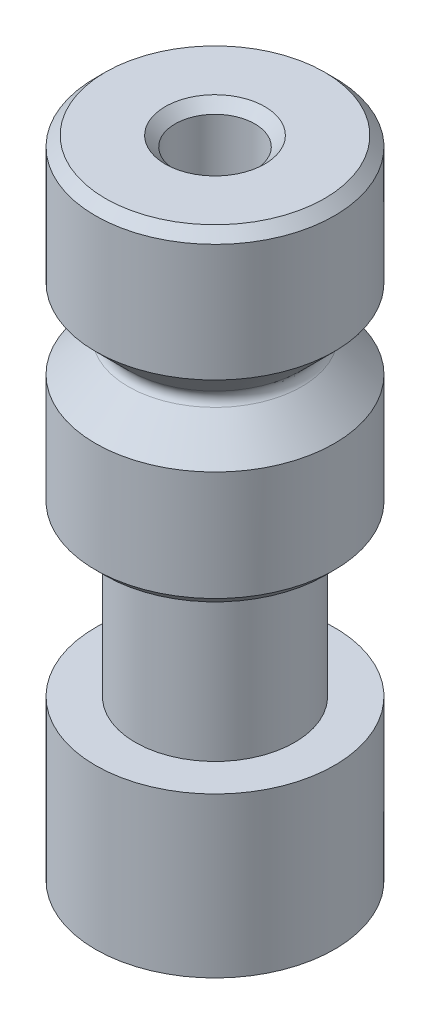
ISO-10303-21;
HEADER;
FILE_DESCRIPTION(('STEP AP214'),'2;1');
FILE_NAME('part.step','',(''),(''),'','','');
FILE_SCHEMA(('AUTOMOTIVE_DESIGN { 1 0 10303 214 1 1 1 1 }'));
ENDSEC;
DATA;
#1=APPLICATION_CONTEXT('core data for automotive mechanical design processes');
#2=APPLICATION_PROTOCOL_DEFINITION('international standard','automotive_design',2000,#1);
#3=PRODUCT_CONTEXT('',#1,'mechanical');
#4=PRODUCT('Part','Part','',(#3));
#5=PRODUCT_RELATED_PRODUCT_CATEGORY('part','',(#4));
#6=PRODUCT_DEFINITION_FORMATION('','',#4);
#7=PRODUCT_DEFINITION_CONTEXT('part definition',#1,'design');
#8=PRODUCT_DEFINITION('design','',#6,#7);
#9=PRODUCT_DEFINITION_SHAPE('','',#8);
#10=(LENGTH_UNIT() NAMED_UNIT(*) SI_UNIT(.MILLI.,.METRE.));
#11=(NAMED_UNIT(*) PLANE_ANGLE_UNIT() SI_UNIT($,.RADIAN.));
#12=(NAMED_UNIT(*) SI_UNIT($,.STERADIAN.) SOLID_ANGLE_UNIT());
#13=UNCERTAINTY_MEASURE_WITH_UNIT(LENGTH_MEASURE(1.E-05),#10,'distance_accuracy_value','');
#14=(GEOMETRIC_REPRESENTATION_CONTEXT(3) GLOBAL_UNCERTAINTY_ASSIGNED_CONTEXT((#13)) GLOBAL_UNIT_ASSIGNED_CONTEXT((#10,
#11,#12)) REPRESENTATION_CONTEXT('',''));
#15=CARTESIAN_POINT('',(0.,0.,0.));
#16=DIRECTION('',(0.,0.,1.));
#17=DIRECTION('',(1.,0.,0.));
#18=AXIS2_PLACEMENT_3D('',#15,#16,#17);
#19=CARTESIAN_POINT('',(0.,54.1999536612987,0.));
#20=DIRECTION('',(0.,1.,0.));
#21=DIRECTION('',(0.,0.,1.));
#22=AXIS2_PLACEMENT_3D('',#19,#20,#21);
#23=CYLINDRICAL_SURFACE('',#22,2.99999999999999);
#24=CARTESIAN_POINT('',(0.,-12.,0.));
#25=DIRECTION('',(0.,1.,0.));
#26=DIRECTION('',(0.,0.,1.));
#27=AXIS2_PLACEMENT_3D('',#24,#25,#26);
#28=CIRCLE('',#27,2.99999999999998);
#29=CARTESIAN_POINT('',(0.,-12.,2.99999999999998));
#30=VERTEX_POINT('',#29);
#31=EDGE_CURVE('E71',#30,#30,#28,.T.);
#32=ORIENTED_EDGE('',*,*,#31,.T.);
#33=EDGE_LOOP('',(#32));
#34=FACE_BOUND('',#33,.T.);
#35=CARTESIAN_POINT('',(0.,-8.,0.));
#36=DIRECTION('',(0.,1.,0.));
#37=DIRECTION('',(0.,0.,1.));
#38=AXIS2_PLACEMENT_3D('',#35,#36,#37);
#39=CIRCLE('',#38,2.99999999999999);
#40=CARTESIAN_POINT('',(0.,-8.,2.99999999999999));
#41=VERTEX_POINT('',#40);
#42=EDGE_CURVE('E92',#41,#41,#39,.T.);
#43=ORIENTED_EDGE('',*,*,#42,.F.);
#44=EDGE_LOOP('',(#43));
#45=FACE_BOUND('',#44,.T.);
#46=ADVANCED_FACE('F33',(#34,#45),#23,.T.);
#47=CARTESIAN_POINT('',(-2.99999999999998,-12.,0.));
#48=DIRECTION('',(0.,-1.,0.));
#49=DIRECTION('',(0.,0.,-1.));
#50=AXIS2_PLACEMENT_3D('',#47,#48,#49);
#51=PLANE('',#50);
#52=CARTESIAN_POINT('',(0.,-12.,0.));
#53=DIRECTION('',(0.,1.,0.));
#54=DIRECTION('',(0.,0.,1.));
#55=AXIS2_PLACEMENT_3D('',#52,#53,#54);
#56=CIRCLE('',#55,1.99999999999999);
#57=CARTESIAN_POINT('',(0.,-12.,1.99999999999999));
#58=VERTEX_POINT('',#57);
#59=EDGE_CURVE('E74',#58,#58,#56,.T.);
#60=ORIENTED_EDGE('',*,*,#59,.T.);
#61=EDGE_LOOP('',(#60));
#62=FACE_BOUND('',#61,.T.);
#63=ORIENTED_EDGE('',*,*,#31,.F.);
#64=EDGE_LOOP('',(#63));
#65=FACE_BOUND('',#64,.T.);
#66=ADVANCED_FACE('F100',(#62,#65),#51,.T.);
#67=CARTESIAN_POINT('',(0.,54.1999536612987,0.));
#68=DIRECTION('',(0.,1.,0.));
#69=DIRECTION('',(0.,0.,1.));
#70=AXIS2_PLACEMENT_3D('',#67,#68,#69);
#71=CYLINDRICAL_SURFACE('',#70,1.99999999999999);
#72=CARTESIAN_POINT('',(0.,-12.5,0.));
#73=DIRECTION('',(0.,-1.,0.));
#74=DIRECTION('',(0.,0.,-1.));
#75=AXIS2_PLACEMENT_3D('',#72,#73,#74);
#76=CIRCLE('',#75,1.99999999999999);
#77=CARTESIAN_POINT('',(0.,-12.5,-1.99999999999999));
#78=VERTEX_POINT('',#77);
#79=EDGE_CURVE('E62',#78,#78,#76,.F.);
#80=ORIENTED_EDGE('',*,*,#79,.T.);
#81=EDGE_LOOP('',(#80));
#82=FACE_BOUND('',#81,.T.);
#83=ORIENTED_EDGE('',*,*,#59,.F.);
#84=EDGE_LOOP('',(#83));
#85=FACE_BOUND('',#84,.T.);
#86=ADVANCED_FACE('F106',(#82,#85),#71,.T.);
#87=CARTESIAN_POINT('',(-1.99999999999999,-13.,0.));
#88=DIRECTION('',(0.,-1.,0.));
#89=DIRECTION('',(0.,0.,-1.));
#90=AXIS2_PLACEMENT_3D('',#87,#88,#89);
#91=PLANE('',#90);
#92=CARTESIAN_POINT('',(0.,-13.,0.));
#93=DIRECTION('',(0.,-1.,0.));
#94=DIRECTION('',(0.,0.,-1.));
#95=AXIS2_PLACEMENT_3D('',#92,#93,#94);
#96=CIRCLE('',#95,1.49999999999999);
#97=CARTESIAN_POINT('',(0.,-13.,-1.49999999999999));
#98=VERTEX_POINT('',#97);
#99=EDGE_CURVE('E59',#98,#98,#96,.T.);
#100=ORIENTED_EDGE('',*,*,#99,.T.);
#101=EDGE_LOOP('',(#100));
#102=FACE_BOUND('',#101,.T.);
#103=CARTESIAN_POINT('',(0.,-13.,0.));
#104=DIRECTION('',(0.,1.,0.));
#105=DIRECTION('',(0.,0.,1.));
#106=AXIS2_PLACEMENT_3D('',#103,#104,#105);
#107=CIRCLE('',#106,0.999999999999992);
#108=CARTESIAN_POINT('',(0.,-13.,0.999999999999992));
#109=VERTEX_POINT('',#108);
#110=EDGE_CURVE('E77',#109,#109,#107,.T.);
#111=ORIENTED_EDGE('',*,*,#110,.T.);
#112=EDGE_LOOP('',(#111));
#113=FACE_BOUND('',#112,.T.);
#114=ADVANCED_FACE('F145',(#102,#113),#91,.T.);
#115=CARTESIAN_POINT('',(0.,54.1999536612987,0.));
#116=DIRECTION('',(0.,1.,0.));
#117=DIRECTION('',(0.,0.,1.));
#118=AXIS2_PLACEMENT_3D('',#115,#116,#117);
#119=CYLINDRICAL_SURFACE('',#118,0.999999999999993);
#120=CARTESIAN_POINT('',(0.,3.95,0.));
#121=DIRECTION('',(0.,1.,0.));
#122=DIRECTION('',(0.,0.,1.));
#123=AXIS2_PLACEMENT_3D('',#120,#121,#122);
#124=CIRCLE('',#123,0.999999999999993);
#125=CARTESIAN_POINT('',(0.,3.95,0.999999999999993));
#126=VERTEX_POINT('',#125);
#127=EDGE_CURVE('E68',#126,#126,#124,.T.);
#128=ORIENTED_EDGE('',*,*,#127,.T.);
#129=EDGE_LOOP('',(#128));
#130=FACE_BOUND('',#129,.T.);
#131=ORIENTED_EDGE('',*,*,#110,.F.);
#132=EDGE_LOOP('',(#131));
#133=FACE_BOUND('',#132,.T.);
#134=ADVANCED_FACE('F137',(#130,#133),#119,.F.);
#135=CARTESIAN_POINT('',(-0.999999999999994,4.2,0.));
#136=DIRECTION('',(0.,1.,0.));
#137=DIRECTION('',(0.,0.,1.));
#138=AXIS2_PLACEMENT_3D('',#135,#136,#137);
#139=PLANE('',#138);
#140=CARTESIAN_POINT('',(0.,4.2,0.));
#141=DIRECTION('',(0.,1.,0.));
#142=DIRECTION('',(0.,0.,1.));
#143=AXIS2_PLACEMENT_3D('',#140,#141,#142);
#144=CIRCLE('',#143,2.74999999999998);
#145=CARTESIAN_POINT('',(0.,4.2,2.74999999999998));
#146=VERTEX_POINT('',#145);
#147=EDGE_CURVE('E48',#146,#146,#144,.T.);
#148=ORIENTED_EDGE('',*,*,#147,.T.);
#149=EDGE_LOOP('',(#148));
#150=FACE_BOUND('',#149,.T.);
#151=CARTESIAN_POINT('',(0.,4.2,0.));
#152=DIRECTION('',(0.,1.,0.));
#153=DIRECTION('',(0.,0.,1.));
#154=AXIS2_PLACEMENT_3D('',#151,#152,#153);
#155=CIRCLE('',#154,1.25);
#156=CARTESIAN_POINT('',(0.,4.2,1.25));
#157=VERTEX_POINT('',#156);
#158=EDGE_CURVE('E65',#157,#157,#155,.F.);
#159=ORIENTED_EDGE('',*,*,#158,.T.);
#160=EDGE_LOOP('',(#159));
#161=FACE_BOUND('',#160,.T.);
#162=ADVANCED_FACE('F133',(#150,#161),#139,.T.);
#163=CARTESIAN_POINT('',(0.,54.1999536612987,0.));
#164=DIRECTION('',(0.,1.,0.));
#165=DIRECTION('',(0.,0.,1.));
#166=AXIS2_PLACEMENT_3D('',#163,#164,#165);
#167=CYLINDRICAL_SURFACE('',#166,2.99999999999999);
#168=CARTESIAN_POINT('',(0.,3.95,0.));
#169=DIRECTION('',(0.,1.,0.));
#170=DIRECTION('',(0.,0.,1.));
#171=AXIS2_PLACEMENT_3D('',#168,#169,#170);
#172=CIRCLE('',#171,2.99999999999999);
#173=CARTESIAN_POINT('',(0.,3.95,2.99999999999999));
#174=VERTEX_POINT('',#173);
#175=EDGE_CURVE('E44',#174,#174,#172,.F.);
#176=ORIENTED_EDGE('',*,*,#175,.T.);
#177=EDGE_LOOP('',(#176));
#178=FACE_BOUND('',#177,.T.);
#179=CARTESIAN_POINT('',(0.,0.999999999999994,0.));
#180=DIRECTION('',(0.,1.,0.));
#181=DIRECTION('',(0.,0.,1.));
#182=AXIS2_PLACEMENT_3D('',#179,#180,#181);
#183=CIRCLE('',#182,2.99999999999999);
#184=CARTESIAN_POINT('',(0.,0.999999999999994,2.99999999999999));
#185=VERTEX_POINT('',#184);
#186=EDGE_CURVE('E80',#185,#185,#183,.T.);
#187=ORIENTED_EDGE('',*,*,#186,.T.);
#188=EDGE_LOOP('',(#187));
#189=FACE_BOUND('',#188,.T.);
#190=ADVANCED_FACE('F136',(#178,#189),#167,.T.);
#191=CARTESIAN_POINT('',(0.,0.999999999999994,0.));
#192=DIRECTION('',(0.,1.,0.));
#193=DIRECTION('',(0.,0.,1.));
#194=AXIS2_PLACEMENT_3D('',#191,#192,#193);
#195=CONICAL_SURFACE('',#194,2.99999999999999,0.785398163397448);
#196=CARTESIAN_POINT('',(0.,0.176776695296637,0.));
#197=DIRECTION('',(0.,1.,0.));
#198=DIRECTION('',(0.,0.,1.));
#199=AXIS2_PLACEMENT_3D('',#196,#197,#198);
#200=CIRCLE('',#199,2.17677669529663);
#201=CARTESIAN_POINT('',(0.,0.176776695296637,2.17677669529663));
#202=VERTEX_POINT('',#201);
#203=EDGE_CURVE('E40',#202,#202,#200,.T.);
#204=ORIENTED_EDGE('',*,*,#203,.T.);
#205=EDGE_LOOP('',(#204));
#206=FACE_BOUND('',#205,.T.);
#207=ORIENTED_EDGE('',*,*,#186,.F.);
#208=EDGE_LOOP('',(#207));
#209=FACE_BOUND('',#208,.T.);
#210=ADVANCED_FACE('F159',(#206,#209),#195,.T.);
#211=CARTESIAN_POINT('',(0.,0.,0.));
#212=DIRECTION('',(0.,-1.,0.));
#213=DIRECTION('',(0.,0.,-1.));
#214=AXIS2_PLACEMENT_3D('',#211,#212,#213);
#215=CONICAL_SURFACE('',#214,1.99999999999999,0.785398163397448);
#216=CARTESIAN_POINT('',(0.,-0.176776695296637,0.));
#217=DIRECTION('',(0.,-1.,0.));
#218=DIRECTION('',(0.,0.,-1.));
#219=AXIS2_PLACEMENT_3D('',#216,#217,#218);
#220=CIRCLE('',#219,2.17677669529663);
#221=CARTESIAN_POINT('',(0.,-0.176776695296637,-2.17677669529663));
#222=VERTEX_POINT('',#221);
#223=EDGE_CURVE('E10',#222,#222,#220,.T.);
#224=ORIENTED_EDGE('',*,*,#223,.T.);
#225=EDGE_LOOP('',(#224));
#226=FACE_BOUND('',#225,.T.);
#227=CARTESIAN_POINT('',(0.,-0.999999999999994,0.));
#228=DIRECTION('',(0.,1.,0.));
#229=DIRECTION('',(0.,0.,1.));
#230=AXIS2_PLACEMENT_3D('',#227,#228,#229);
#231=CIRCLE('',#230,2.99999999999999);
#232=CARTESIAN_POINT('',(0.,-0.999999999999994,2.99999999999999));
#233=VERTEX_POINT('',#232);
#234=EDGE_CURVE('E83',#233,#233,#231,.T.);
#235=ORIENTED_EDGE('',*,*,#234,.T.);
#236=EDGE_LOOP('',(#235));
#237=FACE_BOUND('',#236,.T.);
#238=ADVANCED_FACE('F163',(#226,#237),#215,.T.);
#239=CARTESIAN_POINT('',(0.,54.1999536612987,0.));
#240=DIRECTION('',(0.,1.,0.));
#241=DIRECTION('',(0.,0.,1.));
#242=AXIS2_PLACEMENT_3D('',#239,#240,#241);
#243=CYLINDRICAL_SURFACE('',#242,2.99999999999999);
#244=CARTESIAN_POINT('',(0.,-3.75,0.));
#245=DIRECTION('',(0.,-1.,0.));
#246=DIRECTION('',(0.,0.,-1.));
#247=AXIS2_PLACEMENT_3D('',#244,#245,#246);
#248=CIRCLE('',#247,2.99999999999999);
#249=CARTESIAN_POINT('',(0.,-3.75,-2.99999999999999));
#250=VERTEX_POINT('',#249);
#251=EDGE_CURVE('E56',#250,#250,#248,.F.);
#252=ORIENTED_EDGE('',*,*,#251,.T.);
#253=EDGE_LOOP('',(#252));
#254=FACE_BOUND('',#253,.T.);
#255=ORIENTED_EDGE('',*,*,#234,.F.);
#256=EDGE_LOOP('',(#255));
#257=FACE_BOUND('',#256,.T.);
#258=ADVANCED_FACE('F166',(#254,#257),#243,.T.);
#259=CARTESIAN_POINT('',(-2.99999999999999,-4.,0.));
#260=DIRECTION('',(0.,-1.,0.));
#261=DIRECTION('',(0.,0.,-1.));
#262=AXIS2_PLACEMENT_3D('',#259,#260,#261);
#263=PLANE('',#262);
#264=CARTESIAN_POINT('',(0.,-4.,0.));
#265=DIRECTION('',(0.,-1.,0.));
#266=DIRECTION('',(0.,0.,-1.));
#267=AXIS2_PLACEMENT_3D('',#264,#265,#266);
#268=CIRCLE('',#267,2.74999999999999);
#269=CARTESIAN_POINT('',(0.,-4.,-2.74999999999999));
#270=VERTEX_POINT('',#269);
#271=EDGE_CURVE('E53',#270,#270,#268,.T.);
#272=ORIENTED_EDGE('',*,*,#271,.T.);
#273=EDGE_LOOP('',(#272));
#274=FACE_BOUND('',#273,.T.);
#275=CARTESIAN_POINT('',(0.,-4.,0.));
#276=DIRECTION('',(0.,1.,0.));
#277=DIRECTION('',(0.,0.,1.));
#278=AXIS2_PLACEMENT_3D('',#275,#276,#277);
#279=CIRCLE('',#278,1.99999999999999);
#280=CARTESIAN_POINT('',(0.,-4.,1.99999999999999));
#281=VERTEX_POINT('',#280);
#282=EDGE_CURVE('E86',#281,#281,#279,.T.);
#283=ORIENTED_EDGE('',*,*,#282,.T.);
#284=EDGE_LOOP('',(#283));
#285=FACE_BOUND('',#284,.T.);
#286=ADVANCED_FACE('F169',(#274,#285),#263,.T.);
#287=CARTESIAN_POINT('',(0.,54.1999536612987,0.));
#288=DIRECTION('',(0.,1.,0.));
#289=DIRECTION('',(0.,0.,1.));
#290=AXIS2_PLACEMENT_3D('',#287,#288,#289);
#291=CYLINDRICAL_SURFACE('',#290,1.99999999999999);
#292=CARTESIAN_POINT('',(0.,-8.,0.));
#293=DIRECTION('',(0.,1.,0.));
#294=DIRECTION('',(0.,0.,1.));
#295=AXIS2_PLACEMENT_3D('',#292,#293,#294);
#296=CIRCLE('',#295,1.99999999999999);
#297=CARTESIAN_POINT('',(0.,-8.,1.99999999999999));
#298=VERTEX_POINT('',#297);
#299=EDGE_CURVE('E89',#298,#298,#296,.T.);
#300=ORIENTED_EDGE('',*,*,#299,.T.);
#301=EDGE_LOOP('',(#300));
#302=FACE_BOUND('',#301,.T.);
#303=ORIENTED_EDGE('',*,*,#282,.F.);
#304=EDGE_LOOP('',(#303));
#305=FACE_BOUND('',#304,.T.);
#306=ADVANCED_FACE('F173',(#302,#305),#291,.T.);
#307=CARTESIAN_POINT('',(-1.99999999999999,-8.,0.));
#308=DIRECTION('',(0.,1.,0.));
#309=DIRECTION('',(0.,0.,1.));
#310=AXIS2_PLACEMENT_3D('',#307,#308,#309);
#311=PLANE('',#310);
#312=ORIENTED_EDGE('',*,*,#42,.T.);
#313=EDGE_LOOP('',(#312));
#314=FACE_BOUND('',#313,.T.);
#315=ORIENTED_EDGE('',*,*,#299,.F.);
#316=EDGE_LOOP('',(#315));
#317=FACE_BOUND('',#316,.T.);
#318=ADVANCED_FACE('F96',(#314,#317),#311,.T.);
#319=CARTESIAN_POINT('',(0.,3.95,0.));
#320=DIRECTION('',(0.,1.,0.));
#321=DIRECTION('',(0.,0.,1.));
#322=AXIS2_PLACEMENT_3D('',#319,#320,#321);
#323=CONICAL_SURFACE('',#322,0.999999999999993,0.785398163397458);
#324=ORIENTED_EDGE('',*,*,#158,.F.);
#325=EDGE_LOOP('',(#324));
#326=FACE_BOUND('',#325,.T.);
#327=ORIENTED_EDGE('',*,*,#127,.F.);
#328=EDGE_LOOP('',(#327));
#329=FACE_BOUND('',#328,.T.);
#330=ADVANCED_FACE('F111',(#326,#329),#323,.F.);
#331=CARTESIAN_POINT('',(0.,-12.5,0.));
#332=DIRECTION('',(0.,1.,0.));
#333=DIRECTION('',(0.,0.,1.));
#334=AXIS2_PLACEMENT_3D('',#331,#332,#333);
#335=CONICAL_SURFACE('',#334,1.99999999999999,0.785398163397459);
#336=ORIENTED_EDGE('',*,*,#99,.F.);
#337=EDGE_LOOP('',(#336));
#338=FACE_BOUND('',#337,.T.);
#339=ORIENTED_EDGE('',*,*,#79,.F.);
#340=EDGE_LOOP('',(#339));
#341=FACE_BOUND('',#340,.T.);
#342=ADVANCED_FACE('F114',(#338,#341),#335,.T.);
#343=CARTESIAN_POINT('',(0.,-3.75,0.));
#344=DIRECTION('',(0.,1.,0.));
#345=DIRECTION('',(0.,0.,1.));
#346=AXIS2_PLACEMENT_3D('',#343,#344,#345);
#347=CONICAL_SURFACE('',#346,2.99999999999999,0.785398163397441);
#348=ORIENTED_EDGE('',*,*,#271,.F.);
#349=EDGE_LOOP('',(#348));
#350=FACE_BOUND('',#349,.T.);
#351=ORIENTED_EDGE('',*,*,#251,.F.);
#352=EDGE_LOOP('',(#351));
#353=FACE_BOUND('',#352,.T.);
#354=ADVANCED_FACE('F118',(#350,#353),#347,.T.);
#355=CARTESIAN_POINT('',(0.,4.2,0.));
#356=DIRECTION('',(0.,-1.,0.));
#357=DIRECTION('',(0.,0.,-1.));
#358=AXIS2_PLACEMENT_3D('',#355,#356,#357);
#359=CONICAL_SURFACE('',#358,2.74999999999999,0.785398163397447);
#360=ORIENTED_EDGE('',*,*,#175,.F.);
#361=EDGE_LOOP('',(#360));
#362=FACE_BOUND('',#361,.T.);
#363=ORIENTED_EDGE('',*,*,#147,.F.);
#364=EDGE_LOOP('',(#363));
#365=FACE_BOUND('',#364,.T.);
#366=ADVANCED_FACE('F121',(#362,#365),#359,.T.);
#367=CARTESIAN_POINT('',(0.,0.,0.));
#368=DIRECTION('',(0.,1.,0.));
#369=DIRECTION('',(0.,0.,1.));
#370=AXIS2_PLACEMENT_3D('',#367,#368,#369);
#371=TOROIDAL_SURFACE('',#370,2.35355339059327,0.25);
#372=ORIENTED_EDGE('',*,*,#223,.F.);
#373=EDGE_LOOP('',(#372));
#374=FACE_BOUND('',#373,.T.);
#375=ORIENTED_EDGE('',*,*,#203,.F.);
#376=EDGE_LOOP('',(#375));
#377=FACE_BOUND('',#376,.T.);
#378=ADVANCED_FACE('F35',(#374,#377),#371,.F.);
#379=CLOSED_SHELL('',(#46,#66,#86,#114,#134,#162,#190,#210,#238,#258,#286,#306,#318,#330,#342,
#354,#366,#378));
#380=MANIFOLD_SOLID_BREP('B2',#379);
#381=ADVANCED_BREP_SHAPE_REPRESENTATION('',(#18,#380),#14);
#382=SHAPE_DEFINITION_REPRESENTATION(#9,#381);
ENDSEC;
END-ISO-10303-21;
